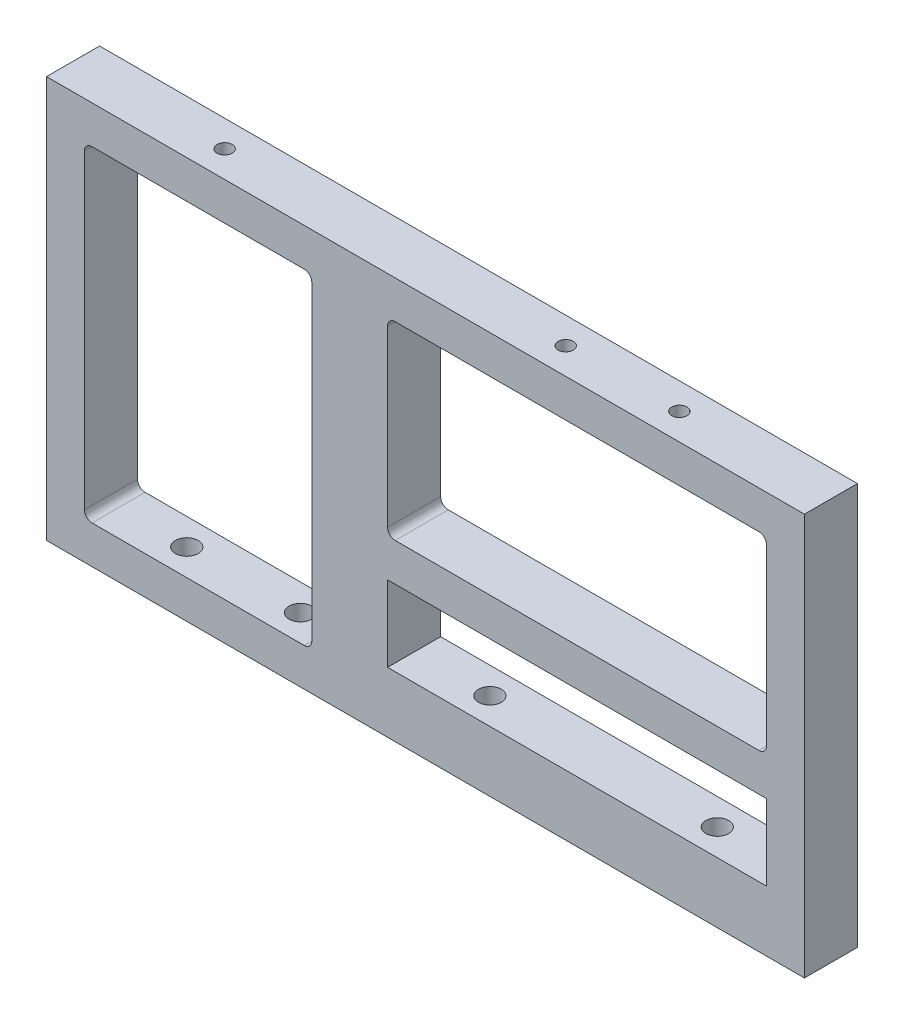
ISO-10303-21;
HEADER;
FILE_DESCRIPTION(('STEP AP214'),'2;1');
FILE_NAME('part.step','',(''),(''),'','','');
FILE_SCHEMA(('AUTOMOTIVE_DESIGN { 1 0 10303 214 1 1 1 1 }'));
ENDSEC;
DATA;
#1=APPLICATION_CONTEXT('core data for automotive mechanical design processes');
#2=APPLICATION_PROTOCOL_DEFINITION('international standard','automotive_design',2000,#1);
#3=PRODUCT_CONTEXT('',#1,'mechanical');
#4=PRODUCT('Part','Part','',(#3));
#5=PRODUCT_RELATED_PRODUCT_CATEGORY('part','',(#4));
#6=PRODUCT_DEFINITION_FORMATION('','',#4);
#7=PRODUCT_DEFINITION_CONTEXT('part definition',#1,'design');
#8=PRODUCT_DEFINITION('design','',#6,#7);
#9=PRODUCT_DEFINITION_SHAPE('','',#8);
#10=(LENGTH_UNIT() NAMED_UNIT(*) SI_UNIT(.MILLI.,.METRE.));
#11=(NAMED_UNIT(*) PLANE_ANGLE_UNIT() SI_UNIT($,.RADIAN.));
#12=(NAMED_UNIT(*) SI_UNIT($,.STERADIAN.) SOLID_ANGLE_UNIT());
#13=UNCERTAINTY_MEASURE_WITH_UNIT(LENGTH_MEASURE(1.E-05),#10,'distance_accuracy_value','');
#14=(GEOMETRIC_REPRESENTATION_CONTEXT(3) GLOBAL_UNCERTAINTY_ASSIGNED_CONTEXT((#13)) GLOBAL_UNIT_ASSIGNED_CONTEXT((#10,
#11,#12)) REPRESENTATION_CONTEXT('',''));
#15=CARTESIAN_POINT('',(0.,0.,0.));
#16=DIRECTION('',(0.,0.,1.));
#17=DIRECTION('',(1.,0.,0.));
#18=AXIS2_PLACEMENT_3D('',#15,#16,#17);
#19=CARTESIAN_POINT('',(0.,0.,7.));
#20=DIRECTION('',(0.,0.,1.));
#21=DIRECTION('',(1.,0.,0.));
#22=AXIS2_PLACEMENT_3D('',#19,#20,#21);
#23=PLANE('',#22);
#24=DIRECTION('',(0.,-1.,0.));
#25=VECTOR('',#24,1.);
#26=CARTESIAN_POINT('',(0.,53.,7.));
#27=LINE('',#26,#25);
#28=CARTESIAN_POINT('',(0.,53.,7.));
#29=VERTEX_POINT('',#28);
#30=CARTESIAN_POINT('',(0.,0.,7.));
#31=VERTEX_POINT('',#30);
#32=EDGE_CURVE('E290',#29,#31,#27,.T.);
#33=ORIENTED_EDGE('',*,*,#32,.T.);
#34=DIRECTION('',(1.,0.,0.));
#35=VECTOR('',#34,1.);
#36=CARTESIAN_POINT('',(0.,0.,7.));
#37=LINE('',#36,#35);
#38=CARTESIAN_POINT('',(100.,0.,7.));
#39=VERTEX_POINT('',#38);
#40=EDGE_CURVE('E293',#31,#39,#37,.T.);
#41=ORIENTED_EDGE('',*,*,#40,.T.);
#42=DIRECTION('',(0.,1.,0.));
#43=VECTOR('',#42,1.);
#44=CARTESIAN_POINT('',(100.,0.,7.));
#45=LINE('',#44,#43);
#46=CARTESIAN_POINT('',(100.,53.,7.));
#47=VERTEX_POINT('',#46);
#48=EDGE_CURVE('E296',#39,#47,#45,.T.);
#49=ORIENTED_EDGE('',*,*,#48,.T.);
#50=DIRECTION('',(-1.,0.,0.));
#51=VECTOR('',#50,1.);
#52=CARTESIAN_POINT('',(100.,53.,7.));
#53=LINE('',#52,#51);
#54=EDGE_CURVE('E298',#47,#29,#53,.T.);
#55=ORIENTED_EDGE('',*,*,#54,.T.);
#56=EDGE_LOOP('',(#33,#41,#49,#55));
#57=FACE_BOUND('',#56,.T.);
#58=DIRECTION('',(0.,-1.,0.));
#59=VECTOR('',#58,1.);
#60=CARTESIAN_POINT('',(5.,48.,7.));
#61=LINE('',#60,#59);
#62=CARTESIAN_POINT('',(5.,47.,7.));
#63=VERTEX_POINT('',#62);
#64=CARTESIAN_POINT('',(5.00000000000001,6.00000000000001,7.));
#65=VERTEX_POINT('',#64);
#66=EDGE_CURVE('E270',#63,#65,#61,.T.);
#67=ORIENTED_EDGE('',*,*,#66,.F.);
#68=CARTESIAN_POINT('',(6.,47.,7.));
#69=DIRECTION('',(0.,0.,1.));
#70=DIRECTION('',(1.,0.,0.));
#71=AXIS2_PLACEMENT_3D('',#68,#69,#70);
#72=CIRCLE('',#71,1.);
#73=CARTESIAN_POINT('',(6.,48.,7.));
#74=VERTEX_POINT('',#73);
#75=EDGE_CURVE('E11',#63,#74,#72,.F.);
#76=ORIENTED_EDGE('',*,*,#75,.T.);
#77=DIRECTION('',(-1.,0.,0.));
#78=VECTOR('',#77,1.);
#79=CARTESIAN_POINT('',(35.,48.,7.));
#80=LINE('',#79,#78);
#81=CARTESIAN_POINT('',(34.,48.,7.));
#82=VERTEX_POINT('',#81);
#83=EDGE_CURVE('E267',#82,#74,#80,.T.);
#84=ORIENTED_EDGE('',*,*,#83,.F.);
#85=CARTESIAN_POINT('',(34.,47.,7.));
#86=DIRECTION('',(0.,0.,1.));
#87=DIRECTION('',(1.,0.,0.));
#88=AXIS2_PLACEMENT_3D('',#85,#86,#87);
#89=CIRCLE('',#88,1.);
#90=CARTESIAN_POINT('',(35.,47.,7.));
#91=VERTEX_POINT('',#90);
#92=EDGE_CURVE('E376',#82,#91,#89,.F.);
#93=ORIENTED_EDGE('',*,*,#92,.T.);
#94=DIRECTION('',(0.,1.,0.));
#95=VECTOR('',#94,1.);
#96=CARTESIAN_POINT('',(35.,5.,7.));
#97=LINE('',#96,#95);
#98=CARTESIAN_POINT('',(35.,6.,7.));
#99=VERTEX_POINT('',#98);
#100=EDGE_CURVE('E276',#99,#91,#97,.T.);
#101=ORIENTED_EDGE('',*,*,#100,.F.);
#102=CARTESIAN_POINT('',(34.,6.,7.));
#103=DIRECTION('',(0.,0.,1.));
#104=DIRECTION('',(1.,0.,0.));
#105=AXIS2_PLACEMENT_3D('',#102,#103,#104);
#106=CIRCLE('',#105,1.);
#107=CARTESIAN_POINT('',(34.,5.,7.));
#108=VERTEX_POINT('',#107);
#109=EDGE_CURVE('E380',#99,#108,#106,.F.);
#110=ORIENTED_EDGE('',*,*,#109,.T.);
#111=DIRECTION('',(1.,0.,0.));
#112=VECTOR('',#111,1.);
#113=CARTESIAN_POINT('',(5.00000000000001,5.,7.));
#114=LINE('',#113,#112);
#115=CARTESIAN_POINT('',(6.00000000000001,5.,7.));
#116=VERTEX_POINT('',#115);
#117=EDGE_CURVE('E273',#116,#108,#114,.T.);
#118=ORIENTED_EDGE('',*,*,#117,.F.);
#119=CARTESIAN_POINT('',(6.00000000000001,6.00000000000001,7.));
#120=DIRECTION('',(0.,0.,1.));
#121=DIRECTION('',(1.,0.,0.));
#122=AXIS2_PLACEMENT_3D('',#119,#120,#121);
#123=CIRCLE('',#122,1.);
#124=EDGE_CURVE('E52',#116,#65,#123,.F.);
#125=ORIENTED_EDGE('',*,*,#124,.T.);
#126=EDGE_LOOP('',(#67,#76,#84,#93,#101,#110,#118,#125));
#127=FACE_BOUND('',#126,.T.);
#128=DIRECTION('',(0.,-1.,0.));
#129=VECTOR('',#128,1.);
#130=CARTESIAN_POINT('',(45.,48.,7.));
#131=LINE('',#130,#129);
#132=CARTESIAN_POINT('',(45.,47.,7.));
#133=VERTEX_POINT('',#132);
#134=CARTESIAN_POINT('',(45.,24.,7.));
#135=VERTEX_POINT('',#134);
#136=EDGE_CURVE('E246',#133,#135,#131,.T.);
#137=ORIENTED_EDGE('',*,*,#136,.F.);
#138=CARTESIAN_POINT('',(46.,47.,7.));
#139=DIRECTION('',(0.,0.,1.));
#140=DIRECTION('',(1.,0.,0.));
#141=AXIS2_PLACEMENT_3D('',#138,#139,#140);
#142=CIRCLE('',#141,1.);
#143=CARTESIAN_POINT('',(46.,48.,7.));
#144=VERTEX_POINT('',#143);
#145=EDGE_CURVE('E372',#133,#144,#142,.F.);
#146=ORIENTED_EDGE('',*,*,#145,.T.);
#147=DIRECTION('',(-1.,0.,0.));
#148=VECTOR('',#147,1.);
#149=CARTESIAN_POINT('',(95.,48.,7.));
#150=LINE('',#149,#148);
#151=CARTESIAN_POINT('',(94.,48.,7.));
#152=VERTEX_POINT('',#151);
#153=EDGE_CURVE('E243',#152,#144,#150,.T.);
#154=ORIENTED_EDGE('',*,*,#153,.F.);
#155=CARTESIAN_POINT('',(94.,47.,7.));
#156=DIRECTION('',(0.,0.,1.));
#157=DIRECTION('',(1.,0.,0.));
#158=AXIS2_PLACEMENT_3D('',#155,#156,#157);
#159=CIRCLE('',#158,1.);
#160=CARTESIAN_POINT('',(95.,47.,7.));
#161=VERTEX_POINT('',#160);
#162=EDGE_CURVE('E364',#152,#161,#159,.F.);
#163=ORIENTED_EDGE('',*,*,#162,.T.);
#164=DIRECTION('',(0.,1.,0.));
#165=VECTOR('',#164,1.);
#166=CARTESIAN_POINT('',(95.,23.,7.));
#167=LINE('',#166,#165);
#168=CARTESIAN_POINT('',(95.,24.,7.));
#169=VERTEX_POINT('',#168);
#170=EDGE_CURVE('E253',#169,#161,#167,.T.);
#171=ORIENTED_EDGE('',*,*,#170,.F.);
#172=CARTESIAN_POINT('',(94.,24.,7.));
#173=DIRECTION('',(0.,0.,1.));
#174=DIRECTION('',(1.,0.,0.));
#175=AXIS2_PLACEMENT_3D('',#172,#173,#174);
#176=CIRCLE('',#175,1.);
#177=CARTESIAN_POINT('',(94.,23.,7.));
#178=VERTEX_POINT('',#177);
#179=EDGE_CURVE('E360',#169,#178,#176,.F.);
#180=ORIENTED_EDGE('',*,*,#179,.T.);
#181=DIRECTION('',(1.,0.,0.));
#182=VECTOR('',#181,1.);
#183=CARTESIAN_POINT('',(45.,23.,7.));
#184=LINE('',#183,#182);
#185=CARTESIAN_POINT('',(46.,23.,7.));
#186=VERTEX_POINT('',#185);
#187=EDGE_CURVE('E250',#186,#178,#184,.T.);
#188=ORIENTED_EDGE('',*,*,#187,.F.);
#189=CARTESIAN_POINT('',(46.,24.,7.));
#190=DIRECTION('',(0.,0.,1.));
#191=DIRECTION('',(1.,0.,0.));
#192=AXIS2_PLACEMENT_3D('',#189,#190,#191);
#193=CIRCLE('',#192,1.);
#194=EDGE_CURVE('E368',#186,#135,#193,.F.);
#195=ORIENTED_EDGE('',*,*,#194,.T.);
#196=EDGE_LOOP('',(#137,#146,#154,#163,#171,#180,#188,#195));
#197=FACE_BOUND('',#196,.T.);
#198=DIRECTION('',(1.,0.,0.));
#199=VECTOR('',#198,1.);
#200=CARTESIAN_POINT('',(45.,8.00000000000001,7.));
#201=LINE('',#200,#199);
#202=CARTESIAN_POINT('',(45.,8.00000000000001,7.));
#203=VERTEX_POINT('',#202);
#204=CARTESIAN_POINT('',(95.,8.00000000000001,7.));
#205=VERTEX_POINT('',#204);
#206=EDGE_CURVE('E210',#203,#205,#201,.T.);
#207=ORIENTED_EDGE('',*,*,#206,.F.);
#208=DIRECTION('',(0.,-1.,0.));
#209=VECTOR('',#208,1.);
#210=CARTESIAN_POINT('',(45.,18.,7.));
#211=LINE('',#210,#209);
#212=CARTESIAN_POINT('',(45.,18.,7.));
#213=VERTEX_POINT('',#212);
#214=EDGE_CURVE('E200',#213,#203,#211,.T.);
#215=ORIENTED_EDGE('',*,*,#214,.F.);
#216=DIRECTION('',(-1.,0.,0.));
#217=VECTOR('',#216,1.);
#218=CARTESIAN_POINT('',(45.,18.,7.));
#219=LINE('',#218,#217);
#220=CARTESIAN_POINT('',(95.,18.,7.));
#221=VERTEX_POINT('',#220);
#222=EDGE_CURVE('E225',#221,#213,#219,.T.);
#223=ORIENTED_EDGE('',*,*,#222,.F.);
#224=DIRECTION('',(0.,1.,0.));
#225=VECTOR('',#224,1.);
#226=CARTESIAN_POINT('',(95.,8.00000000000001,7.));
#227=LINE('',#226,#225);
#228=EDGE_CURVE('E223',#205,#221,#227,.T.);
#229=ORIENTED_EDGE('',*,*,#228,.F.);
#230=EDGE_LOOP('',(#207,#215,#223,#229));
#231=FACE_BOUND('',#230,.T.);
#232=ADVANCED_FACE('F37',(#57,#127,#197,#231),#23,.T.);
#233=CARTESIAN_POINT('',(0.,0.,0.));
#234=DIRECTION('',(0.,0.,1.));
#235=DIRECTION('',(1.,0.,0.));
#236=AXIS2_PLACEMENT_3D('',#233,#234,#235);
#237=PLANE('',#236);
#238=DIRECTION('',(0.,1.,0.));
#239=VECTOR('',#238,1.);
#240=CARTESIAN_POINT('',(95.,23.,0.));
#241=LINE('',#240,#239);
#242=CARTESIAN_POINT('',(95.,24.,0.));
#243=VERTEX_POINT('',#242);
#244=CARTESIAN_POINT('',(95.,47.,0.));
#245=VERTEX_POINT('',#244);
#246=EDGE_CURVE('E247',#243,#245,#241,.T.);
#247=ORIENTED_EDGE('',*,*,#246,.T.);
#248=CARTESIAN_POINT('',(94.,47.,0.));
#249=DIRECTION('',(0.,0.,1.));
#250=DIRECTION('',(1.,0.,0.));
#251=AXIS2_PLACEMENT_3D('',#248,#249,#250);
#252=CIRCLE('',#251,1.);
#253=CARTESIAN_POINT('',(94.,48.,0.));
#254=VERTEX_POINT('',#253);
#255=EDGE_CURVE('E362',#245,#254,#252,.T.);
#256=ORIENTED_EDGE('',*,*,#255,.T.);
#257=DIRECTION('',(-1.,0.,0.));
#258=VECTOR('',#257,1.);
#259=CARTESIAN_POINT('',(95.,48.,0.));
#260=LINE('',#259,#258);
#261=CARTESIAN_POINT('',(46.,48.,0.));
#262=VERTEX_POINT('',#261);
#263=EDGE_CURVE('E218',#254,#262,#260,.T.);
#264=ORIENTED_EDGE('',*,*,#263,.T.);
#265=CARTESIAN_POINT('',(46.,47.,0.));
#266=DIRECTION('',(0.,0.,1.));
#267=DIRECTION('',(1.,0.,0.));
#268=AXIS2_PLACEMENT_3D('',#265,#266,#267);
#269=CIRCLE('',#268,1.);
#270=CARTESIAN_POINT('',(45.,47.,0.));
#271=VERTEX_POINT('',#270);
#272=EDGE_CURVE('E370',#262,#271,#269,.T.);
#273=ORIENTED_EDGE('',*,*,#272,.T.);
#274=DIRECTION('',(0.,-1.,0.));
#275=VECTOR('',#274,1.);
#276=CARTESIAN_POINT('',(45.,48.,0.));
#277=LINE('',#276,#275);
#278=CARTESIAN_POINT('',(45.,24.,0.));
#279=VERTEX_POINT('',#278);
#280=EDGE_CURVE('E259',#271,#279,#277,.T.);
#281=ORIENTED_EDGE('',*,*,#280,.T.);
#282=CARTESIAN_POINT('',(46.,24.,0.));
#283=DIRECTION('',(0.,0.,1.));
#284=DIRECTION('',(1.,0.,0.));
#285=AXIS2_PLACEMENT_3D('',#282,#283,#284);
#286=CIRCLE('',#285,1.);
#287=CARTESIAN_POINT('',(46.,23.,0.));
#288=VERTEX_POINT('',#287);
#289=EDGE_CURVE('E366',#279,#288,#286,.T.);
#290=ORIENTED_EDGE('',*,*,#289,.T.);
#291=DIRECTION('',(1.,0.,0.));
#292=VECTOR('',#291,1.);
#293=CARTESIAN_POINT('',(45.,23.,0.));
#294=LINE('',#293,#292);
#295=CARTESIAN_POINT('',(94.,23.,0.));
#296=VERTEX_POINT('',#295);
#297=EDGE_CURVE('E262',#288,#296,#294,.T.);
#298=ORIENTED_EDGE('',*,*,#297,.T.);
#299=CARTESIAN_POINT('',(94.,24.,0.));
#300=DIRECTION('',(0.,0.,1.));
#301=DIRECTION('',(1.,0.,0.));
#302=AXIS2_PLACEMENT_3D('',#299,#300,#301);
#303=CIRCLE('',#302,1.);
#304=EDGE_CURVE('E358',#296,#243,#303,.T.);
#305=ORIENTED_EDGE('',*,*,#304,.T.);
#306=EDGE_LOOP('',(#247,#256,#264,#273,#281,#290,#298,#305));
#307=FACE_BOUND('',#306,.T.);
#308=DIRECTION('',(0.,-1.,0.));
#309=VECTOR('',#308,1.);
#310=CARTESIAN_POINT('',(0.,53.,0.));
#311=LINE('',#310,#309);
#312=CARTESIAN_POINT('',(0.,53.,0.));
#313=VERTEX_POINT('',#312);
#314=CARTESIAN_POINT('',(0.,0.,0.));
#315=VERTEX_POINT('',#314);
#316=EDGE_CURVE('E279',#313,#315,#311,.T.);
#317=ORIENTED_EDGE('',*,*,#316,.F.);
#318=DIRECTION('',(-1.,0.,0.));
#319=VECTOR('',#318,1.);
#320=CARTESIAN_POINT('',(100.,53.,0.));
#321=LINE('',#320,#319);
#322=CARTESIAN_POINT('',(100.,53.,0.));
#323=VERTEX_POINT('',#322);
#324=EDGE_CURVE('E294',#323,#313,#321,.T.);
#325=ORIENTED_EDGE('',*,*,#324,.F.);
#326=DIRECTION('',(0.,1.,0.));
#327=VECTOR('',#326,1.);
#328=CARTESIAN_POINT('',(100.,0.,0.));
#329=LINE('',#328,#327);
#330=CARTESIAN_POINT('',(100.,0.,0.));
#331=VERTEX_POINT('',#330);
#332=EDGE_CURVE('E305',#331,#323,#329,.T.);
#333=ORIENTED_EDGE('',*,*,#332,.F.);
#334=DIRECTION('',(1.,0.,0.));
#335=VECTOR('',#334,1.);
#336=CARTESIAN_POINT('',(0.,0.,0.));
#337=LINE('',#336,#335);
#338=EDGE_CURVE('E303',#315,#331,#337,.T.);
#339=ORIENTED_EDGE('',*,*,#338,.F.);
#340=EDGE_LOOP('',(#317,#325,#333,#339));
#341=FACE_BOUND('',#340,.T.);
#342=DIRECTION('',(0.,1.,0.));
#343=VECTOR('',#342,1.);
#344=CARTESIAN_POINT('',(35.,5.,0.));
#345=LINE('',#344,#343);
#346=CARTESIAN_POINT('',(35.,6.,0.));
#347=VERTEX_POINT('',#346);
#348=CARTESIAN_POINT('',(35.,47.,0.));
#349=VERTEX_POINT('',#348);
#350=EDGE_CURVE('E271',#347,#349,#345,.T.);
#351=ORIENTED_EDGE('',*,*,#350,.T.);
#352=CARTESIAN_POINT('',(34.,47.,0.));
#353=DIRECTION('',(0.,0.,1.));
#354=DIRECTION('',(1.,0.,0.));
#355=AXIS2_PLACEMENT_3D('',#352,#353,#354);
#356=CIRCLE('',#355,1.);
#357=CARTESIAN_POINT('',(34.,48.,0.));
#358=VERTEX_POINT('',#357);
#359=EDGE_CURVE('E374',#349,#358,#356,.T.);
#360=ORIENTED_EDGE('',*,*,#359,.T.);
#361=DIRECTION('',(-1.,0.,0.));
#362=VECTOR('',#361,1.);
#363=CARTESIAN_POINT('',(35.,48.,0.));
#364=LINE('',#363,#362);
#365=CARTESIAN_POINT('',(6.,48.,0.));
#366=VERTEX_POINT('',#365);
#367=EDGE_CURVE('E256',#358,#366,#364,.T.);
#368=ORIENTED_EDGE('',*,*,#367,.T.);
#369=CARTESIAN_POINT('',(6.,47.,0.));
#370=DIRECTION('',(0.,0.,1.));
#371=DIRECTION('',(1.,0.,0.));
#372=AXIS2_PLACEMENT_3D('',#369,#370,#371);
#373=CIRCLE('',#372,1.);
#374=CARTESIAN_POINT('',(5.,47.,0.));
#375=VERTEX_POINT('',#374);
#376=EDGE_CURVE('E45',#366,#375,#373,.T.);
#377=ORIENTED_EDGE('',*,*,#376,.T.);
#378=DIRECTION('',(0.,-1.,0.));
#379=VECTOR('',#378,1.);
#380=CARTESIAN_POINT('',(5.,48.,0.));
#381=LINE('',#380,#379);
#382=CARTESIAN_POINT('',(5.00000000000001,6.00000000000001,0.));
#383=VERTEX_POINT('',#382);
#384=EDGE_CURVE('E282',#375,#383,#381,.T.);
#385=ORIENTED_EDGE('',*,*,#384,.T.);
#386=CARTESIAN_POINT('',(6.00000000000001,6.00000000000001,0.));
#387=DIRECTION('',(0.,0.,1.));
#388=DIRECTION('',(1.,0.,0.));
#389=AXIS2_PLACEMENT_3D('',#386,#387,#388);
#390=CIRCLE('',#389,1.);
#391=CARTESIAN_POINT('',(6.00000000000001,5.,0.));
#392=VERTEX_POINT('',#391);
#393=EDGE_CURVE('E382',#383,#392,#390,.T.);
#394=ORIENTED_EDGE('',*,*,#393,.T.);
#395=DIRECTION('',(1.,0.,0.));
#396=VECTOR('',#395,1.);
#397=CARTESIAN_POINT('',(5.00000000000001,5.,0.));
#398=LINE('',#397,#396);
#399=CARTESIAN_POINT('',(34.,5.,0.));
#400=VERTEX_POINT('',#399);
#401=EDGE_CURVE('E285',#392,#400,#398,.T.);
#402=ORIENTED_EDGE('',*,*,#401,.T.);
#403=CARTESIAN_POINT('',(34.,6.,0.));
#404=DIRECTION('',(0.,0.,1.));
#405=DIRECTION('',(1.,0.,0.));
#406=AXIS2_PLACEMENT_3D('',#403,#404,#405);
#407=CIRCLE('',#406,1.);
#408=EDGE_CURVE('E378',#400,#347,#407,.T.);
#409=ORIENTED_EDGE('',*,*,#408,.T.);
#410=EDGE_LOOP('',(#351,#360,#368,#377,#385,#394,#402,#409));
#411=FACE_BOUND('',#410,.T.);
#412=DIRECTION('',(0.,-1.,0.));
#413=VECTOR('',#412,1.);
#414=CARTESIAN_POINT('',(45.,18.,0.));
#415=LINE('',#414,#413);
#416=CARTESIAN_POINT('',(45.,18.,0.));
#417=VERTEX_POINT('',#416);
#418=CARTESIAN_POINT('',(45.,8.00000000000001,0.));
#419=VERTEX_POINT('',#418);
#420=EDGE_CURVE('E230',#417,#419,#415,.T.);
#421=ORIENTED_EDGE('',*,*,#420,.T.);
#422=DIRECTION('',(1.,0.,0.));
#423=VECTOR('',#422,1.);
#424=CARTESIAN_POINT('',(45.,8.00000000000001,0.));
#425=LINE('',#424,#423);
#426=CARTESIAN_POINT('',(95.,8.00000000000001,0.));
#427=VERTEX_POINT('',#426);
#428=EDGE_CURVE('E217',#419,#427,#425,.T.);
#429=ORIENTED_EDGE('',*,*,#428,.T.);
#430=DIRECTION('',(0.,1.,0.));
#431=VECTOR('',#430,1.);
#432=CARTESIAN_POINT('',(95.,8.00000000000001,0.));
#433=LINE('',#432,#431);
#434=CARTESIAN_POINT('',(95.,18.,0.));
#435=VERTEX_POINT('',#434);
#436=EDGE_CURVE('E234',#427,#435,#433,.T.);
#437=ORIENTED_EDGE('',*,*,#436,.T.);
#438=DIRECTION('',(-1.,0.,0.));
#439=VECTOR('',#438,1.);
#440=CARTESIAN_POINT('',(45.,18.,0.));
#441=LINE('',#440,#439);
#442=EDGE_CURVE('E211',#435,#417,#441,.T.);
#443=ORIENTED_EDGE('',*,*,#442,.T.);
#444=EDGE_LOOP('',(#421,#429,#437,#443));
#445=FACE_BOUND('',#444,.T.);
#446=ADVANCED_FACE('F385',(#307,#341,#411,#445),#237,.F.);
#447=CARTESIAN_POINT('',(0.,53.,7.));
#448=DIRECTION('',(1.,0.,0.));
#449=DIRECTION('',(0.,1.,0.));
#450=AXIS2_PLACEMENT_3D('',#447,#448,#449);
#451=PLANE('',#450);
#452=ORIENTED_EDGE('',*,*,#316,.T.);
#453=DIRECTION('',(0.,0.,-1.));
#454=VECTOR('',#453,1.);
#455=CARTESIAN_POINT('',(0.,0.,7.));
#456=LINE('',#455,#454);
#457=EDGE_CURVE('E316',#31,#315,#456,.T.);
#458=ORIENTED_EDGE('',*,*,#457,.F.);
#459=ORIENTED_EDGE('',*,*,#32,.F.);
#460=DIRECTION('',(0.,0.,-1.));
#461=VECTOR('',#460,1.);
#462=CARTESIAN_POINT('',(0.,53.,7.));
#463=LINE('',#462,#461);
#464=EDGE_CURVE('E300',#29,#313,#463,.T.);
#465=ORIENTED_EDGE('',*,*,#464,.T.);
#466=EDGE_LOOP('',(#452,#458,#459,#465));
#467=FACE_BOUND('',#466,.T.);
#468=ADVANCED_FACE('F430',(#467),#451,.F.);
#469=CARTESIAN_POINT('',(0.,0.,7.));
#470=DIRECTION('',(0.,1.,0.));
#471=DIRECTION('',(0.,0.,1.));
#472=AXIS2_PLACEMENT_3D('',#469,#470,#471);
#473=PLANE('',#472);
#474=CARTESIAN_POINT('',(15.,0.,3.5));
#475=DIRECTION('',(0.,-1.,0.));
#476=DIRECTION('',(0.,0.,-1.));
#477=AXIS2_PLACEMENT_3D('',#474,#475,#476);
#478=CIRCLE('',#477,1.5);
#479=CARTESIAN_POINT('',(15.,0.,2.));
#480=VERTEX_POINT('',#479);
#481=EDGE_CURVE('E232',#480,#480,#478,.T.);
#482=ORIENTED_EDGE('',*,*,#481,.F.);
#483=EDGE_LOOP('',(#482));
#484=FACE_BOUND('',#483,.T.);
#485=CARTESIAN_POINT('',(85.,0.,3.5));
#486=DIRECTION('',(0.,-1.,0.));
#487=DIRECTION('',(0.,0.,-1.));
#488=AXIS2_PLACEMENT_3D('',#485,#486,#487);
#489=CIRCLE('',#488,1.5);
#490=CARTESIAN_POINT('',(85.,0.,2.));
#491=VERTEX_POINT('',#490);
#492=EDGE_CURVE('E852',#491,#491,#489,.T.);
#493=ORIENTED_EDGE('',*,*,#492,.F.);
#494=EDGE_LOOP('',(#493));
#495=FACE_BOUND('',#494,.T.);
#496=CARTESIAN_POINT('',(55.,0.,3.5));
#497=DIRECTION('',(0.,-1.,0.));
#498=DIRECTION('',(0.,0.,-1.));
#499=AXIS2_PLACEMENT_3D('',#496,#497,#498);
#500=CIRCLE('',#499,1.5);
#501=CARTESIAN_POINT('',(55.,0.,2.));
#502=VERTEX_POINT('',#501);
#503=EDGE_CURVE('E858',#502,#502,#500,.T.);
#504=ORIENTED_EDGE('',*,*,#503,.F.);
#505=EDGE_LOOP('',(#504));
#506=FACE_BOUND('',#505,.T.);
#507=CARTESIAN_POINT('',(30.,0.,3.5));
#508=DIRECTION('',(0.,-1.,0.));
#509=DIRECTION('',(0.,0.,-1.));
#510=AXIS2_PLACEMENT_3D('',#507,#508,#509);
#511=CIRCLE('',#510,1.5);
#512=CARTESIAN_POINT('',(30.,0.,2.));
#513=VERTEX_POINT('',#512);
#514=EDGE_CURVE('E863',#513,#513,#511,.T.);
#515=ORIENTED_EDGE('',*,*,#514,.F.);
#516=EDGE_LOOP('',(#515));
#517=FACE_BOUND('',#516,.T.);
#518=ORIENTED_EDGE('',*,*,#338,.T.);
#519=DIRECTION('',(0.,0.,-1.));
#520=VECTOR('',#519,1.);
#521=CARTESIAN_POINT('',(100.,0.,7.));
#522=LINE('',#521,#520);
#523=EDGE_CURVE('E313',#39,#331,#522,.T.);
#524=ORIENTED_EDGE('',*,*,#523,.F.);
#525=ORIENTED_EDGE('',*,*,#40,.F.);
#526=ORIENTED_EDGE('',*,*,#457,.T.);
#527=EDGE_LOOP('',(#518,#524,#525,#526));
#528=FACE_BOUND('',#527,.T.);
#529=ADVANCED_FACE('F443',(#484,#495,#506,#517,#528),#473,.F.);
#530=CARTESIAN_POINT('',(100.,0.,7.));
#531=DIRECTION('',(-1.,0.,0.));
#532=DIRECTION('',(0.,0.,1.));
#533=AXIS2_PLACEMENT_3D('',#530,#531,#532);
#534=PLANE('',#533);
#535=ORIENTED_EDGE('',*,*,#332,.T.);
#536=DIRECTION('',(0.,0.,-1.));
#537=VECTOR('',#536,1.);
#538=CARTESIAN_POINT('',(100.,53.,7.));
#539=LINE('',#538,#537);
#540=EDGE_CURVE('E310',#47,#323,#539,.T.);
#541=ORIENTED_EDGE('',*,*,#540,.F.);
#542=ORIENTED_EDGE('',*,*,#48,.F.);
#543=ORIENTED_EDGE('',*,*,#523,.T.);
#544=EDGE_LOOP('',(#535,#541,#542,#543));
#545=FACE_BOUND('',#544,.T.);
#546=ADVANCED_FACE('F439',(#545),#534,.F.);
#547=CARTESIAN_POINT('',(100.,53.,7.));
#548=DIRECTION('',(0.,-1.,0.));
#549=DIRECTION('',(1.,0.,0.));
#550=AXIS2_PLACEMENT_3D('',#547,#548,#549);
#551=PLANE('',#550);
#552=CARTESIAN_POINT('',(80.,53.,3.49999999999999));
#553=DIRECTION('',(0.,1.,0.));
#554=DIRECTION('',(-1.,0.,0.));
#555=AXIS2_PLACEMENT_3D('',#552,#553,#554);
#556=CIRCLE('',#555,0.999999999999998);
#557=CARTESIAN_POINT('',(79.,53.,3.49999999999999));
#558=VERTEX_POINT('',#557);
#559=EDGE_CURVE('E869',#558,#558,#556,.T.);
#560=ORIENTED_EDGE('',*,*,#559,.F.);
#561=EDGE_LOOP('',(#560));
#562=FACE_BOUND('',#561,.T.);
#563=CARTESIAN_POINT('',(65.,53.,3.49999999999999));
#564=DIRECTION('',(0.,1.,0.));
#565=DIRECTION('',(-1.,0.,0.));
#566=AXIS2_PLACEMENT_3D('',#563,#564,#565);
#567=CIRCLE('',#566,0.999999999999998);
#568=CARTESIAN_POINT('',(64.,53.,3.49999999999999));
#569=VERTEX_POINT('',#568);
#570=EDGE_CURVE('E839',#569,#569,#567,.T.);
#571=ORIENTED_EDGE('',*,*,#570,.F.);
#572=EDGE_LOOP('',(#571));
#573=FACE_BOUND('',#572,.T.);
#574=CARTESIAN_POINT('',(20.,53.,3.49999999999999));
#575=DIRECTION('',(0.,1.,0.));
#576=DIRECTION('',(-1.,0.,0.));
#577=AXIS2_PLACEMENT_3D('',#574,#575,#576);
#578=CIRCLE('',#577,1.);
#579=CARTESIAN_POINT('',(19.,53.,3.49999999999999));
#580=VERTEX_POINT('',#579);
#581=EDGE_CURVE('E834',#580,#580,#578,.T.);
#582=ORIENTED_EDGE('',*,*,#581,.F.);
#583=EDGE_LOOP('',(#582));
#584=FACE_BOUND('',#583,.T.);
#585=ORIENTED_EDGE('',*,*,#324,.T.);
#586=ORIENTED_EDGE('',*,*,#464,.F.);
#587=ORIENTED_EDGE('',*,*,#54,.F.);
#588=ORIENTED_EDGE('',*,*,#540,.T.);
#589=EDGE_LOOP('',(#585,#586,#587,#588));
#590=FACE_BOUND('',#589,.T.);
#591=ADVANCED_FACE('F436',(#562,#573,#584,#590),#551,.F.);
#592=CARTESIAN_POINT('',(35.,48.,7.));
#593=DIRECTION('',(0.,-1.,0.));
#594=DIRECTION('',(1.,0.,0.));
#595=AXIS2_PLACEMENT_3D('',#592,#593,#594);
#596=PLANE('',#595);
#597=CARTESIAN_POINT('',(20.,48.,3.49999999999999));
#598=DIRECTION('',(0.,1.,0.));
#599=DIRECTION('',(-1.,0.,0.));
#600=AXIS2_PLACEMENT_3D('',#597,#598,#599);
#601=CIRCLE('',#600,1.);
#602=CARTESIAN_POINT('',(19.,48.,3.49999999999999));
#603=VERTEX_POINT('',#602);
#604=EDGE_CURVE('E831',#603,#603,#601,.T.);
#605=ORIENTED_EDGE('',*,*,#604,.T.);
#606=EDGE_LOOP('',(#605));
#607=FACE_BOUND('',#606,.T.);
#608=ORIENTED_EDGE('',*,*,#367,.F.);
#609=DIRECTION('',(0.,0.,-1.));
#610=VECTOR('',#609,1.);
#611=CARTESIAN_POINT('',(34.,48.,7.));
#612=LINE('',#611,#610);
#613=EDGE_CURVE('E347',#358,#82,#612,.F.);
#614=ORIENTED_EDGE('',*,*,#613,.T.);
#615=ORIENTED_EDGE('',*,*,#83,.T.);
#616=DIRECTION('',(0.,0.,-1.));
#617=VECTOR('',#616,1.);
#618=CARTESIAN_POINT('',(6.,48.,0.));
#619=LINE('',#618,#617);
#620=EDGE_CURVE('E344',#74,#366,#619,.T.);
#621=ORIENTED_EDGE('',*,*,#620,.T.);
#622=EDGE_LOOP('',(#608,#614,#615,#621));
#623=FACE_BOUND('',#622,.T.);
#624=ADVANCED_FACE('F397',(#607,#623),#596,.T.);
#625=CARTESIAN_POINT('',(5.,48.,7.));
#626=DIRECTION('',(1.,0.,0.));
#627=DIRECTION('',(0.,1.,0.));
#628=AXIS2_PLACEMENT_3D('',#625,#626,#627);
#629=PLANE('',#628);
#630=ORIENTED_EDGE('',*,*,#66,.T.);
#631=DIRECTION('',(0.,0.,-1.));
#632=VECTOR('',#631,1.);
#633=CARTESIAN_POINT('',(5.00000000000001,6.00000000000001,0.));
#634=LINE('',#633,#632);
#635=EDGE_CURVE('E355',#65,#383,#634,.T.);
#636=ORIENTED_EDGE('',*,*,#635,.T.);
#637=ORIENTED_EDGE('',*,*,#384,.F.);
#638=DIRECTION('',(0.,0.,-1.));
#639=VECTOR('',#638,1.);
#640=CARTESIAN_POINT('',(5.,47.,7.));
#641=LINE('',#640,#639);
#642=EDGE_CURVE('E59',#375,#63,#641,.F.);
#643=ORIENTED_EDGE('',*,*,#642,.T.);
#644=EDGE_LOOP('',(#630,#636,#637,#643));
#645=FACE_BOUND('',#644,.T.);
#646=ADVANCED_FACE('F390',(#645),#629,.T.);
#647=CARTESIAN_POINT('',(5.00000000000001,5.,7.));
#648=DIRECTION('',(0.,1.,0.));
#649=DIRECTION('',(0.,0.,1.));
#650=AXIS2_PLACEMENT_3D('',#647,#648,#649);
#651=PLANE('',#650);
#652=CARTESIAN_POINT('',(15.,5.,3.5));
#653=DIRECTION('',(0.,1.,0.));
#654=DIRECTION('',(0.,0.,1.));
#655=AXIS2_PLACEMENT_3D('',#652,#653,#654);
#656=CIRCLE('',#655,1.5);
#657=CARTESIAN_POINT('',(15.,5.,5.));
#658=VERTEX_POINT('',#657);
#659=EDGE_CURVE('E846',#658,#658,#656,.F.);
#660=ORIENTED_EDGE('',*,*,#659,.T.);
#661=EDGE_LOOP('',(#660));
#662=FACE_BOUND('',#661,.T.);
#663=CARTESIAN_POINT('',(30.,5.,3.5));
#664=DIRECTION('',(0.,1.,0.));
#665=DIRECTION('',(0.,0.,1.));
#666=AXIS2_PLACEMENT_3D('',#663,#664,#665);
#667=CIRCLE('',#666,1.5);
#668=CARTESIAN_POINT('',(30.,5.,5.));
#669=VERTEX_POINT('',#668);
#670=EDGE_CURVE('E861',#669,#669,#667,.F.);
#671=ORIENTED_EDGE('',*,*,#670,.T.);
#672=EDGE_LOOP('',(#671));
#673=FACE_BOUND('',#672,.T.);
#674=ORIENTED_EDGE('',*,*,#117,.T.);
#675=DIRECTION('',(0.,0.,-1.));
#676=VECTOR('',#675,1.);
#677=CARTESIAN_POINT('',(34.,5.,0.));
#678=LINE('',#677,#676);
#679=EDGE_CURVE('E351',#108,#400,#678,.T.);
#680=ORIENTED_EDGE('',*,*,#679,.T.);
#681=ORIENTED_EDGE('',*,*,#401,.F.);
#682=DIRECTION('',(0.,0.,-1.));
#683=VECTOR('',#682,1.);
#684=CARTESIAN_POINT('',(6.00000000000001,5.,7.));
#685=LINE('',#684,#683);
#686=EDGE_CURVE('E349',#392,#116,#685,.F.);
#687=ORIENTED_EDGE('',*,*,#686,.T.);
#688=EDGE_LOOP('',(#674,#680,#681,#687));
#689=FACE_BOUND('',#688,.T.);
#690=ADVANCED_FACE('F412',(#662,#673,#689),#651,.T.);
#691=CARTESIAN_POINT('',(35.,5.,7.));
#692=DIRECTION('',(-1.,0.,0.));
#693=DIRECTION('',(0.,-1.,0.));
#694=AXIS2_PLACEMENT_3D('',#691,#692,#693);
#695=PLANE('',#694);
#696=ORIENTED_EDGE('',*,*,#100,.T.);
#697=DIRECTION('',(0.,0.,-1.));
#698=VECTOR('',#697,1.);
#699=CARTESIAN_POINT('',(35.,47.,0.));
#700=LINE('',#699,#698);
#701=EDGE_CURVE('E341',#91,#349,#700,.T.);
#702=ORIENTED_EDGE('',*,*,#701,.T.);
#703=ORIENTED_EDGE('',*,*,#350,.F.);
#704=DIRECTION('',(0.,0.,-1.));
#705=VECTOR('',#704,1.);
#706=CARTESIAN_POINT('',(35.,6.,7.));
#707=LINE('',#706,#705);
#708=EDGE_CURVE('E339',#347,#99,#707,.F.);
#709=ORIENTED_EDGE('',*,*,#708,.T.);
#710=EDGE_LOOP('',(#696,#702,#703,#709));
#711=FACE_BOUND('',#710,.T.);
#712=ADVANCED_FACE('F405',(#711),#695,.T.);
#713=CARTESIAN_POINT('',(95.,48.,7.));
#714=DIRECTION('',(0.,-1.,0.));
#715=DIRECTION('',(1.,0.,0.));
#716=AXIS2_PLACEMENT_3D('',#713,#714,#715);
#717=PLANE('',#716);
#718=CARTESIAN_POINT('',(80.,48.,3.49999999999999));
#719=DIRECTION('',(0.,1.,0.));
#720=DIRECTION('',(-1.,0.,0.));
#721=AXIS2_PLACEMENT_3D('',#718,#719,#720);
#722=CIRCLE('',#721,0.999999999999998);
#723=CARTESIAN_POINT('',(79.,48.,3.49999999999999));
#724=VERTEX_POINT('',#723);
#725=EDGE_CURVE('E865',#724,#724,#722,.T.);
#726=ORIENTED_EDGE('',*,*,#725,.T.);
#727=EDGE_LOOP('',(#726));
#728=FACE_BOUND('',#727,.T.);
#729=CARTESIAN_POINT('',(65.,48.,3.49999999999999));
#730=DIRECTION('',(0.,1.,0.));
#731=DIRECTION('',(-1.,0.,0.));
#732=AXIS2_PLACEMENT_3D('',#729,#730,#731);
#733=CIRCLE('',#732,0.999999999999998);
#734=CARTESIAN_POINT('',(64.,48.,3.49999999999999));
#735=VERTEX_POINT('',#734);
#736=EDGE_CURVE('E836',#735,#735,#733,.T.);
#737=ORIENTED_EDGE('',*,*,#736,.T.);
#738=EDGE_LOOP('',(#737));
#739=FACE_BOUND('',#738,.T.);
#740=ORIENTED_EDGE('',*,*,#263,.F.);
#741=DIRECTION('',(0.,0.,-1.));
#742=VECTOR('',#741,1.);
#743=CARTESIAN_POINT('',(94.,48.,7.));
#744=LINE('',#743,#742);
#745=EDGE_CURVE('E332',#254,#152,#744,.F.);
#746=ORIENTED_EDGE('',*,*,#745,.T.);
#747=ORIENTED_EDGE('',*,*,#153,.T.);
#748=DIRECTION('',(0.,0.,-1.));
#749=VECTOR('',#748,1.);
#750=CARTESIAN_POINT('',(46.,48.,0.));
#751=LINE('',#750,#749);
#752=EDGE_CURVE('E329',#144,#262,#751,.T.);
#753=ORIENTED_EDGE('',*,*,#752,.T.);
#754=EDGE_LOOP('',(#740,#746,#747,#753));
#755=FACE_BOUND('',#754,.T.);
#756=ADVANCED_FACE('F595',(#728,#739,#755),#717,.T.);
#757=CARTESIAN_POINT('',(45.,48.,7.));
#758=DIRECTION('',(1.,0.,0.));
#759=DIRECTION('',(0.,0.,-1.));
#760=AXIS2_PLACEMENT_3D('',#757,#758,#759);
#761=PLANE('',#760);
#762=ORIENTED_EDGE('',*,*,#136,.T.);
#763=DIRECTION('',(0.,0.,-1.));
#764=VECTOR('',#763,1.);
#765=CARTESIAN_POINT('',(45.,24.,0.));
#766=LINE('',#765,#764);
#767=EDGE_CURVE('E336',#135,#279,#766,.T.);
#768=ORIENTED_EDGE('',*,*,#767,.T.);
#769=ORIENTED_EDGE('',*,*,#280,.F.);
#770=DIRECTION('',(0.,0.,-1.));
#771=VECTOR('',#770,1.);
#772=CARTESIAN_POINT('',(45.,47.,7.));
#773=LINE('',#772,#771);
#774=EDGE_CURVE('E334',#271,#133,#773,.F.);
#775=ORIENTED_EDGE('',*,*,#774,.T.);
#776=EDGE_LOOP('',(#762,#768,#769,#775));
#777=FACE_BOUND('',#776,.T.);
#778=ADVANCED_FACE('F600',(#777),#761,.T.);
#779=CARTESIAN_POINT('',(45.,23.,7.));
#780=DIRECTION('',(0.,1.,0.));
#781=DIRECTION('',(0.,0.,1.));
#782=AXIS2_PLACEMENT_3D('',#779,#780,#781);
#783=PLANE('',#782);
#784=ORIENTED_EDGE('',*,*,#187,.T.);
#785=DIRECTION('',(0.,0.,-1.));
#786=VECTOR('',#785,1.);
#787=CARTESIAN_POINT('',(94.,23.,0.));
#788=LINE('',#787,#786);
#789=EDGE_CURVE('E321',#178,#296,#788,.T.);
#790=ORIENTED_EDGE('',*,*,#789,.T.);
#791=ORIENTED_EDGE('',*,*,#297,.F.);
#792=DIRECTION('',(0.,0.,-1.));
#793=VECTOR('',#792,1.);
#794=CARTESIAN_POINT('',(46.,23.,7.));
#795=LINE('',#794,#793);
#796=EDGE_CURVE('E319',#288,#186,#795,.F.);
#797=ORIENTED_EDGE('',*,*,#796,.T.);
#798=EDGE_LOOP('',(#784,#790,#791,#797));
#799=FACE_BOUND('',#798,.T.);
#800=ADVANCED_FACE('F704',(#799),#783,.T.);
#801=CARTESIAN_POINT('',(95.,23.,7.));
#802=DIRECTION('',(-1.,0.,0.));
#803=DIRECTION('',(0.,0.,1.));
#804=AXIS2_PLACEMENT_3D('',#801,#802,#803);
#805=PLANE('',#804);
#806=ORIENTED_EDGE('',*,*,#246,.F.);
#807=DIRECTION('',(0.,0.,-1.));
#808=VECTOR('',#807,1.);
#809=CARTESIAN_POINT('',(95.,24.,7.));
#810=LINE('',#809,#808);
#811=EDGE_CURVE('E327',#243,#169,#810,.F.);
#812=ORIENTED_EDGE('',*,*,#811,.T.);
#813=ORIENTED_EDGE('',*,*,#170,.T.);
#814=DIRECTION('',(0.,0.,-1.));
#815=VECTOR('',#814,1.);
#816=CARTESIAN_POINT('',(95.,47.,0.));
#817=LINE('',#816,#815);
#818=EDGE_CURVE('E324',#161,#245,#817,.T.);
#819=ORIENTED_EDGE('',*,*,#818,.T.);
#820=EDGE_LOOP('',(#806,#812,#813,#819));
#821=FACE_BOUND('',#820,.T.);
#822=ADVANCED_FACE('F695',(#821),#805,.T.);
#823=CARTESIAN_POINT('',(45.,18.,7.));
#824=DIRECTION('',(1.,0.,0.));
#825=DIRECTION('',(0.,1.,0.));
#826=AXIS2_PLACEMENT_3D('',#823,#824,#825);
#827=PLANE('',#826);
#828=ORIENTED_EDGE('',*,*,#420,.F.);
#829=DIRECTION('',(0.,0.,-1.));
#830=VECTOR('',#829,1.);
#831=CARTESIAN_POINT('',(45.,18.,7.));
#832=LINE('',#831,#830);
#833=EDGE_CURVE('E206',#213,#417,#832,.T.);
#834=ORIENTED_EDGE('',*,*,#833,.F.);
#835=ORIENTED_EDGE('',*,*,#214,.T.);
#836=DIRECTION('',(0.,0.,-1.));
#837=VECTOR('',#836,1.);
#838=CARTESIAN_POINT('',(45.,8.00000000000001,7.));
#839=LINE('',#838,#837);
#840=EDGE_CURVE('E203',#203,#419,#839,.T.);
#841=ORIENTED_EDGE('',*,*,#840,.T.);
#842=EDGE_LOOP('',(#828,#834,#835,#841));
#843=FACE_BOUND('',#842,.T.);
#844=ADVANCED_FACE('F202',(#843),#827,.T.);
#845=CARTESIAN_POINT('',(45.,8.00000000000001,7.));
#846=DIRECTION('',(0.,1.,0.));
#847=DIRECTION('',(0.,0.,1.));
#848=AXIS2_PLACEMENT_3D('',#845,#846,#847);
#849=PLANE('',#848);
#850=CARTESIAN_POINT('',(85.,8.00000000000001,3.5));
#851=DIRECTION('',(0.,1.,0.));
#852=DIRECTION('',(0.,0.,1.));
#853=AXIS2_PLACEMENT_3D('',#850,#851,#852);
#854=CIRCLE('',#853,1.5);
#855=CARTESIAN_POINT('',(85.,8.00000000000001,5.));
#856=VERTEX_POINT('',#855);
#857=EDGE_CURVE('E849',#856,#856,#854,.F.);
#858=ORIENTED_EDGE('',*,*,#857,.T.);
#859=EDGE_LOOP('',(#858));
#860=FACE_BOUND('',#859,.T.);
#861=CARTESIAN_POINT('',(55.,8.00000000000001,3.5));
#862=DIRECTION('',(0.,1.,0.));
#863=DIRECTION('',(0.,0.,1.));
#864=AXIS2_PLACEMENT_3D('',#861,#862,#863);
#865=CIRCLE('',#864,1.5);
#866=CARTESIAN_POINT('',(55.,8.00000000000001,5.));
#867=VERTEX_POINT('',#866);
#868=EDGE_CURVE('E855',#867,#867,#865,.F.);
#869=ORIENTED_EDGE('',*,*,#868,.T.);
#870=EDGE_LOOP('',(#869));
#871=FACE_BOUND('',#870,.T.);
#872=ORIENTED_EDGE('',*,*,#428,.F.);
#873=ORIENTED_EDGE('',*,*,#840,.F.);
#874=ORIENTED_EDGE('',*,*,#206,.T.);
#875=DIRECTION('',(0.,0.,-1.));
#876=VECTOR('',#875,1.);
#877=CARTESIAN_POINT('',(95.,8.00000000000001,7.));
#878=LINE('',#877,#876);
#879=EDGE_CURVE('E219',#205,#427,#878,.T.);
#880=ORIENTED_EDGE('',*,*,#879,.T.);
#881=EDGE_LOOP('',(#872,#873,#874,#880));
#882=FACE_BOUND('',#881,.T.);
#883=ADVANCED_FACE('F214',(#860,#871,#882),#849,.T.);
#884=CARTESIAN_POINT('',(95.,8.00000000000001,7.));
#885=DIRECTION('',(-1.,0.,0.));
#886=DIRECTION('',(0.,0.,1.));
#887=AXIS2_PLACEMENT_3D('',#884,#885,#886);
#888=PLANE('',#887);
#889=ORIENTED_EDGE('',*,*,#436,.F.);
#890=ORIENTED_EDGE('',*,*,#879,.F.);
#891=ORIENTED_EDGE('',*,*,#228,.T.);
#892=DIRECTION('',(0.,0.,-1.));
#893=VECTOR('',#892,1.);
#894=CARTESIAN_POINT('',(95.,18.,7.));
#895=LINE('',#894,#893);
#896=EDGE_CURVE('E240',#221,#435,#895,.T.);
#897=ORIENTED_EDGE('',*,*,#896,.T.);
#898=EDGE_LOOP('',(#889,#890,#891,#897));
#899=FACE_BOUND('',#898,.T.);
#900=ADVANCED_FACE('F524',(#899),#888,.T.);
#901=CARTESIAN_POINT('',(45.,18.,7.));
#902=DIRECTION('',(0.,-1.,0.));
#903=DIRECTION('',(0.,0.,-1.));
#904=AXIS2_PLACEMENT_3D('',#901,#902,#903);
#905=PLANE('',#904);
#906=ORIENTED_EDGE('',*,*,#442,.F.);
#907=ORIENTED_EDGE('',*,*,#896,.F.);
#908=ORIENTED_EDGE('',*,*,#222,.T.);
#909=ORIENTED_EDGE('',*,*,#833,.T.);
#910=EDGE_LOOP('',(#906,#907,#908,#909));
#911=FACE_BOUND('',#910,.T.);
#912=ADVANCED_FACE('F455',(#911),#905,.T.);
#913=CARTESIAN_POINT('',(94.,24.,7.));
#914=DIRECTION('',(0.,0.,1.));
#915=DIRECTION('',(1.,0.,0.));
#916=AXIS2_PLACEMENT_3D('',#913,#914,#915);
#917=CYLINDRICAL_SURFACE('',#916,1.);
#918=ORIENTED_EDGE('',*,*,#179,.F.);
#919=ORIENTED_EDGE('',*,*,#811,.F.);
#920=ORIENTED_EDGE('',*,*,#304,.F.);
#921=ORIENTED_EDGE('',*,*,#789,.F.);
#922=EDGE_LOOP('',(#918,#919,#920,#921));
#923=FACE_BOUND('',#922,.T.);
#924=ADVANCED_FACE('F451',(#923),#917,.F.);
#925=CARTESIAN_POINT('',(94.,47.,7.));
#926=DIRECTION('',(0.,0.,1.));
#927=DIRECTION('',(1.,0.,0.));
#928=AXIS2_PLACEMENT_3D('',#925,#926,#927);
#929=CYLINDRICAL_SURFACE('',#928,1.);
#930=ORIENTED_EDGE('',*,*,#162,.F.);
#931=ORIENTED_EDGE('',*,*,#745,.F.);
#932=ORIENTED_EDGE('',*,*,#255,.F.);
#933=ORIENTED_EDGE('',*,*,#818,.F.);
#934=EDGE_LOOP('',(#930,#931,#932,#933));
#935=FACE_BOUND('',#934,.T.);
#936=ADVANCED_FACE('F454',(#935),#929,.F.);
#937=CARTESIAN_POINT('',(46.,24.,7.));
#938=DIRECTION('',(0.,0.,1.));
#939=DIRECTION('',(1.,0.,0.));
#940=AXIS2_PLACEMENT_3D('',#937,#938,#939);
#941=CYLINDRICAL_SURFACE('',#940,1.);
#942=ORIENTED_EDGE('',*,*,#194,.F.);
#943=ORIENTED_EDGE('',*,*,#796,.F.);
#944=ORIENTED_EDGE('',*,*,#289,.F.);
#945=ORIENTED_EDGE('',*,*,#767,.F.);
#946=EDGE_LOOP('',(#942,#943,#944,#945));
#947=FACE_BOUND('',#946,.T.);
#948=ADVANCED_FACE('F459',(#947),#941,.F.);
#949=CARTESIAN_POINT('',(46.,47.,7.));
#950=DIRECTION('',(0.,0.,1.));
#951=DIRECTION('',(1.,0.,0.));
#952=AXIS2_PLACEMENT_3D('',#949,#950,#951);
#953=CYLINDRICAL_SURFACE('',#952,1.);
#954=ORIENTED_EDGE('',*,*,#145,.F.);
#955=ORIENTED_EDGE('',*,*,#774,.F.);
#956=ORIENTED_EDGE('',*,*,#272,.F.);
#957=ORIENTED_EDGE('',*,*,#752,.F.);
#958=EDGE_LOOP('',(#954,#955,#956,#957));
#959=FACE_BOUND('',#958,.T.);
#960=ADVANCED_FACE('F463',(#959),#953,.F.);
#961=CARTESIAN_POINT('',(34.,47.,7.));
#962=DIRECTION('',(0.,0.,1.));
#963=DIRECTION('',(1.,0.,0.));
#964=AXIS2_PLACEMENT_3D('',#961,#962,#963);
#965=CYLINDRICAL_SURFACE('',#964,1.);
#966=ORIENTED_EDGE('',*,*,#92,.F.);
#967=ORIENTED_EDGE('',*,*,#613,.F.);
#968=ORIENTED_EDGE('',*,*,#359,.F.);
#969=ORIENTED_EDGE('',*,*,#701,.F.);
#970=EDGE_LOOP('',(#966,#967,#968,#969));
#971=FACE_BOUND('',#970,.T.);
#972=ADVANCED_FACE('F400',(#971),#965,.F.);
#973=CARTESIAN_POINT('',(34.,6.,7.));
#974=DIRECTION('',(0.,0.,1.));
#975=DIRECTION('',(1.,0.,0.));
#976=AXIS2_PLACEMENT_3D('',#973,#974,#975);
#977=CYLINDRICAL_SURFACE('',#976,1.);
#978=ORIENTED_EDGE('',*,*,#109,.F.);
#979=ORIENTED_EDGE('',*,*,#708,.F.);
#980=ORIENTED_EDGE('',*,*,#408,.F.);
#981=ORIENTED_EDGE('',*,*,#679,.F.);
#982=EDGE_LOOP('',(#978,#979,#980,#981));
#983=FACE_BOUND('',#982,.T.);
#984=ADVANCED_FACE('F409',(#983),#977,.F.);
#985=CARTESIAN_POINT('',(6.00000000000001,6.00000000000001,7.));
#986=DIRECTION('',(0.,0.,1.));
#987=DIRECTION('',(1.,0.,0.));
#988=AXIS2_PLACEMENT_3D('',#985,#986,#987);
#989=CYLINDRICAL_SURFACE('',#988,1.);
#990=ORIENTED_EDGE('',*,*,#124,.F.);
#991=ORIENTED_EDGE('',*,*,#686,.F.);
#992=ORIENTED_EDGE('',*,*,#393,.F.);
#993=ORIENTED_EDGE('',*,*,#635,.F.);
#994=EDGE_LOOP('',(#990,#991,#992,#993));
#995=FACE_BOUND('',#994,.T.);
#996=ADVANCED_FACE('F416',(#995),#989,.F.);
#997=CARTESIAN_POINT('',(6.,47.,7.));
#998=DIRECTION('',(0.,0.,1.));
#999=DIRECTION('',(1.,0.,0.));
#1000=AXIS2_PLACEMENT_3D('',#997,#998,#999);
#1001=CYLINDRICAL_SURFACE('',#1000,1.);
#1002=ORIENTED_EDGE('',*,*,#75,.F.);
#1003=ORIENTED_EDGE('',*,*,#642,.F.);
#1004=ORIENTED_EDGE('',*,*,#376,.F.);
#1005=ORIENTED_EDGE('',*,*,#620,.F.);
#1006=EDGE_LOOP('',(#1002,#1003,#1004,#1005));
#1007=FACE_BOUND('',#1006,.T.);
#1008=ADVANCED_FACE('F39',(#1007),#1001,.F.);
#1009=CARTESIAN_POINT('',(55.,53.001,3.5));
#1010=DIRECTION('',(0.,-1.,0.));
#1011=DIRECTION('',(0.,0.,-1.));
#1012=AXIS2_PLACEMENT_3D('',#1009,#1010,#1011);
#1013=CYLINDRICAL_SURFACE('',#1012,1.5);
#1014=ORIENTED_EDGE('',*,*,#868,.F.);
#1015=EDGE_LOOP('',(#1014));
#1016=FACE_BOUND('',#1015,.T.);
#1017=ORIENTED_EDGE('',*,*,#503,.T.);
#1018=EDGE_LOOP('',(#1017));
#1019=FACE_BOUND('',#1018,.T.);
#1020=ADVANCED_FACE('F422',(#1016,#1019),#1013,.F.);
#1021=CARTESIAN_POINT('',(85.,53.001,3.5));
#1022=DIRECTION('',(0.,-1.,0.));
#1023=DIRECTION('',(0.,0.,-1.));
#1024=AXIS2_PLACEMENT_3D('',#1021,#1022,#1023);
#1025=CYLINDRICAL_SURFACE('',#1024,1.5);
#1026=ORIENTED_EDGE('',*,*,#857,.F.);
#1027=EDGE_LOOP('',(#1026));
#1028=FACE_BOUND('',#1027,.T.);
#1029=ORIENTED_EDGE('',*,*,#492,.T.);
#1030=EDGE_LOOP('',(#1029));
#1031=FACE_BOUND('',#1030,.T.);
#1032=ADVANCED_FACE('F537',(#1028,#1031),#1025,.F.);
#1033=CARTESIAN_POINT('',(30.,53.001,3.5));
#1034=DIRECTION('',(0.,-1.,0.));
#1035=DIRECTION('',(0.,0.,-1.));
#1036=AXIS2_PLACEMENT_3D('',#1033,#1034,#1035);
#1037=CYLINDRICAL_SURFACE('',#1036,1.5);
#1038=ORIENTED_EDGE('',*,*,#670,.F.);
#1039=EDGE_LOOP('',(#1038));
#1040=FACE_BOUND('',#1039,.T.);
#1041=ORIENTED_EDGE('',*,*,#514,.T.);
#1042=EDGE_LOOP('',(#1041));
#1043=FACE_BOUND('',#1042,.T.);
#1044=ADVANCED_FACE('F548',(#1040,#1043),#1037,.F.);
#1045=CARTESIAN_POINT('',(15.,53.001,3.5));
#1046=DIRECTION('',(0.,-1.,0.));
#1047=DIRECTION('',(0.,0.,-1.));
#1048=AXIS2_PLACEMENT_3D('',#1045,#1046,#1047);
#1049=CYLINDRICAL_SURFACE('',#1048,1.5);
#1050=ORIENTED_EDGE('',*,*,#659,.F.);
#1051=EDGE_LOOP('',(#1050));
#1052=FACE_BOUND('',#1051,.T.);
#1053=ORIENTED_EDGE('',*,*,#481,.T.);
#1054=EDGE_LOOP('',(#1053));
#1055=FACE_BOUND('',#1054,.T.);
#1056=ADVANCED_FACE('F559',(#1052,#1055),#1049,.F.);
#1057=CARTESIAN_POINT('',(65.,48.,3.49999999999999));
#1058=DIRECTION('',(0.,1.,0.));
#1059=DIRECTION('',(-1.,0.,0.));
#1060=AXIS2_PLACEMENT_3D('',#1057,#1058,#1059);
#1061=CYLINDRICAL_SURFACE('',#1060,0.999999999999998);
#1062=ORIENTED_EDGE('',*,*,#736,.F.);
#1063=EDGE_LOOP('',(#1062));
#1064=FACE_BOUND('',#1063,.T.);
#1065=ORIENTED_EDGE('',*,*,#570,.T.);
#1066=EDGE_LOOP('',(#1065));
#1067=FACE_BOUND('',#1066,.T.);
#1068=ADVANCED_FACE('F570',(#1064,#1067),#1061,.F.);
#1069=CARTESIAN_POINT('',(80.,48.,3.49999999999999));
#1070=DIRECTION('',(0.,1.,0.));
#1071=DIRECTION('',(-1.,0.,0.));
#1072=AXIS2_PLACEMENT_3D('',#1069,#1070,#1071);
#1073=CYLINDRICAL_SURFACE('',#1072,0.999999999999998);
#1074=ORIENTED_EDGE('',*,*,#725,.F.);
#1075=EDGE_LOOP('',(#1074));
#1076=FACE_BOUND('',#1075,.T.);
#1077=ORIENTED_EDGE('',*,*,#559,.T.);
#1078=EDGE_LOOP('',(#1077));
#1079=FACE_BOUND('',#1078,.T.);
#1080=ADVANCED_FACE('F611',(#1076,#1079),#1073,.F.);
#1081=CARTESIAN_POINT('',(20.,48.,3.49999999999999));
#1082=DIRECTION('',(0.,1.,0.));
#1083=DIRECTION('',(-1.,0.,0.));
#1084=AXIS2_PLACEMENT_3D('',#1081,#1082,#1083);
#1085=CYLINDRICAL_SURFACE('',#1084,1.);
#1086=ORIENTED_EDGE('',*,*,#604,.F.);
#1087=EDGE_LOOP('',(#1086));
#1088=FACE_BOUND('',#1087,.T.);
#1089=ORIENTED_EDGE('',*,*,#581,.T.);
#1090=EDGE_LOOP('',(#1089));
#1091=FACE_BOUND('',#1090,.T.);
#1092=ADVANCED_FACE('F622',(#1088,#1091),#1085,.F.);
#1093=CLOSED_SHELL('',(#232,#446,#468,#529,#546,#591,#624,#646,#690,#712,#756,#778,#800,#822,
#844,#883,#900,#912,#924,#936,#948,#960,#972,#984,#996,#1008,#1020,#1032,#1044,#1056,#1068,
#1080,#1092));
#1094=MANIFOLD_SOLID_BREP('B2',#1093);
#1095=ADVANCED_BREP_SHAPE_REPRESENTATION('',(#18,#1094),#14);
#1096=SHAPE_DEFINITION_REPRESENTATION(#9,#1095);
ENDSEC;
END-ISO-10303-21;
